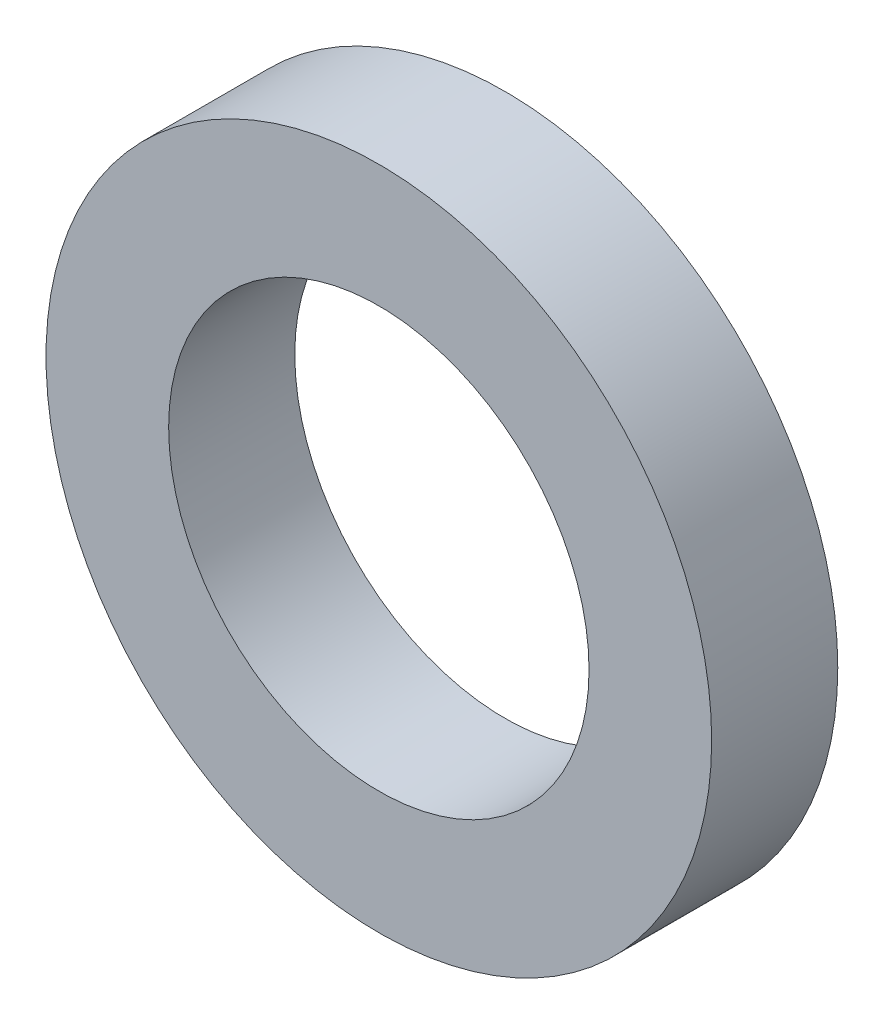
ISO-10303-21;
HEADER;
FILE_DESCRIPTION(('STEP AP214'),'2;1');
FILE_NAME('part.step','',(''),(''),'','','');
FILE_SCHEMA(('AUTOMOTIVE_DESIGN { 1 0 10303 214 1 1 1 1 }'));
ENDSEC;
DATA;
#1=APPLICATION_CONTEXT('core data for automotive mechanical design processes');
#2=APPLICATION_PROTOCOL_DEFINITION('international standard','automotive_design',2000,#1);
#3=PRODUCT_CONTEXT('',#1,'mechanical');
#4=PRODUCT('Part','Part','',(#3));
#5=PRODUCT_RELATED_PRODUCT_CATEGORY('part','',(#4));
#6=PRODUCT_DEFINITION_FORMATION('','',#4);
#7=PRODUCT_DEFINITION_CONTEXT('part definition',#1,'design');
#8=PRODUCT_DEFINITION('design','',#6,#7);
#9=PRODUCT_DEFINITION_SHAPE('','',#8);
#10=(LENGTH_UNIT() NAMED_UNIT(*) SI_UNIT(.MILLI.,.METRE.));
#11=(NAMED_UNIT(*) PLANE_ANGLE_UNIT() SI_UNIT($,.RADIAN.));
#12=(NAMED_UNIT(*) SI_UNIT($,.STERADIAN.) SOLID_ANGLE_UNIT());
#13=UNCERTAINTY_MEASURE_WITH_UNIT(LENGTH_MEASURE(1.E-05),#10,'distance_accuracy_value','');
#14=(GEOMETRIC_REPRESENTATION_CONTEXT(3) GLOBAL_UNCERTAINTY_ASSIGNED_CONTEXT((#13)) GLOBAL_UNIT_ASSIGNED_CONTEXT((#10,
#11,#12)) REPRESENTATION_CONTEXT('',''));
#15=CARTESIAN_POINT('',(0.,0.,0.));
#16=DIRECTION('',(0.,0.,1.));
#17=DIRECTION('',(1.,0.,0.));
#18=AXIS2_PLACEMENT_3D('',#15,#16,#17);
#19=CARTESIAN_POINT('',(0.,0.,18.));
#20=DIRECTION('',(0.,0.,1.));
#21=DIRECTION('',(1.,0.,0.));
#22=AXIS2_PLACEMENT_3D('',#19,#20,#21);
#23=PLANE('',#22);
#24=CARTESIAN_POINT('',(0.,0.,18.));
#25=DIRECTION('',(0.,0.,1.));
#26=DIRECTION('',(1.,0.,0.));
#27=AXIS2_PLACEMENT_3D('',#24,#25,#26);
#28=CIRCLE('',#27,47.5);
#29=CARTESIAN_POINT('',(47.5,0.,18.));
#30=VERTEX_POINT('',#29);
#31=EDGE_CURVE('E10',#30,#30,#28,.T.);
#32=ORIENTED_EDGE('',*,*,#31,.T.);
#33=EDGE_LOOP('',(#32));
#34=FACE_BOUND('',#33,.T.);
#35=CARTESIAN_POINT('',(0.,0.,18.));
#36=DIRECTION('',(0.,0.,1.));
#37=DIRECTION('',(1.,0.,0.));
#38=AXIS2_PLACEMENT_3D('',#35,#36,#37);
#39=CIRCLE('',#38,30.);
#40=CARTESIAN_POINT('',(30.,0.,18.));
#41=VERTEX_POINT('',#40);
#42=EDGE_CURVE('E47',#41,#41,#39,.T.);
#43=ORIENTED_EDGE('',*,*,#42,.F.);
#44=EDGE_LOOP('',(#43));
#45=FACE_BOUND('',#44,.T.);
#46=ADVANCED_FACE('F32',(#34,#45),#23,.T.);
#47=CARTESIAN_POINT('',(0.,0.,0.));
#48=DIRECTION('',(0.,0.,1.));
#49=DIRECTION('',(1.,0.,0.));
#50=AXIS2_PLACEMENT_3D('',#47,#48,#49);
#51=PLANE('',#50);
#52=CARTESIAN_POINT('',(0.,0.,0.));
#53=DIRECTION('',(0.,0.,1.));
#54=DIRECTION('',(1.,0.,0.));
#55=AXIS2_PLACEMENT_3D('',#52,#53,#54);
#56=CIRCLE('',#55,47.5);
#57=CARTESIAN_POINT('',(47.5,0.,0.));
#58=VERTEX_POINT('',#57);
#59=EDGE_CURVE('E36',#58,#58,#56,.T.);
#60=ORIENTED_EDGE('',*,*,#59,.F.);
#61=EDGE_LOOP('',(#60));
#62=FACE_BOUND('',#61,.T.);
#63=CARTESIAN_POINT('',(0.,0.,0.));
#64=DIRECTION('',(0.,0.,1.));
#65=DIRECTION('',(1.,0.,0.));
#66=AXIS2_PLACEMENT_3D('',#63,#64,#65);
#67=CIRCLE('',#66,30.);
#68=CARTESIAN_POINT('',(30.,0.,0.));
#69=VERTEX_POINT('',#68);
#70=EDGE_CURVE('E49',#69,#69,#67,.T.);
#71=ORIENTED_EDGE('',*,*,#70,.T.);
#72=EDGE_LOOP('',(#71));
#73=FACE_BOUND('',#72,.T.);
#74=ADVANCED_FACE('F62',(#62,#73),#51,.F.);
#75=CARTESIAN_POINT('',(0.,0.,18.));
#76=DIRECTION('',(0.,0.,-1.));
#77=DIRECTION('',(-1.,0.,0.));
#78=AXIS2_PLACEMENT_3D('',#75,#76,#77);
#79=CYLINDRICAL_SURFACE('',#78,47.5);
#80=ORIENTED_EDGE('',*,*,#31,.F.);
#81=EDGE_LOOP('',(#80));
#82=FACE_BOUND('',#81,.T.);
#83=ORIENTED_EDGE('',*,*,#59,.T.);
#84=EDGE_LOOP('',(#83));
#85=FACE_BOUND('',#84,.T.);
#86=ADVANCED_FACE('F34',(#82,#85),#79,.T.);
#87=CARTESIAN_POINT('',(0.,0.,18.));
#88=DIRECTION('',(0.,0.,-1.));
#89=DIRECTION('',(-1.,0.,0.));
#90=AXIS2_PLACEMENT_3D('',#87,#88,#89);
#91=CYLINDRICAL_SURFACE('',#90,30.);
#92=ORIENTED_EDGE('',*,*,#42,.T.);
#93=EDGE_LOOP('',(#92));
#94=FACE_BOUND('',#93,.T.);
#95=ORIENTED_EDGE('',*,*,#70,.F.);
#96=EDGE_LOOP('',(#95));
#97=FACE_BOUND('',#96,.T.);
#98=ADVANCED_FACE('F58',(#94,#97),#91,.F.);
#99=CLOSED_SHELL('',(#46,#74,#86,#98));
#100=MANIFOLD_SOLID_BREP('B2',#99);
#101=ADVANCED_BREP_SHAPE_REPRESENTATION('',(#18,#100),#14);
#102=SHAPE_DEFINITION_REPRESENTATION(#9,#101);
ENDSEC;
END-ISO-10303-21;
